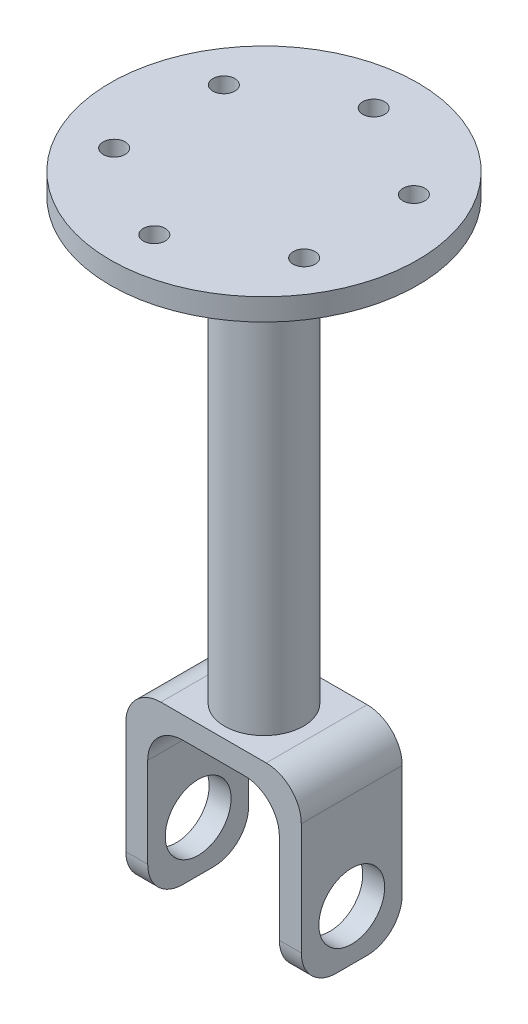
ISO-10303-21;
HEADER;
FILE_DESCRIPTION(('STEP AP214'),'2;1');
FILE_NAME('part.step','',(''),(''),'','','');
FILE_SCHEMA(('AUTOMOTIVE_DESIGN { 1 0 10303 214 1 1 1 1 }'));
ENDSEC;
DATA;
#1=APPLICATION_CONTEXT('core data for automotive mechanical design processes');
#2=APPLICATION_PROTOCOL_DEFINITION('international standard','automotive_design',2000,#1);
#3=PRODUCT_CONTEXT('',#1,'mechanical');
#4=PRODUCT('Part','Part','',(#3));
#5=PRODUCT_RELATED_PRODUCT_CATEGORY('part','',(#4));
#6=PRODUCT_DEFINITION_FORMATION('','',#4);
#7=PRODUCT_DEFINITION_CONTEXT('part definition',#1,'design');
#8=PRODUCT_DEFINITION('design','',#6,#7);
#9=PRODUCT_DEFINITION_SHAPE('','',#8);
#10=(LENGTH_UNIT() NAMED_UNIT(*) SI_UNIT(.MILLI.,.METRE.));
#11=(NAMED_UNIT(*) PLANE_ANGLE_UNIT() SI_UNIT($,.RADIAN.));
#12=(NAMED_UNIT(*) SI_UNIT($,.STERADIAN.) SOLID_ANGLE_UNIT());
#13=UNCERTAINTY_MEASURE_WITH_UNIT(LENGTH_MEASURE(1.E-05),#10,'distance_accuracy_value','');
#14=(GEOMETRIC_REPRESENTATION_CONTEXT(3) GLOBAL_UNCERTAINTY_ASSIGNED_CONTEXT((#13)) GLOBAL_UNIT_ASSIGNED_CONTEXT((#10,
#11,#12)) REPRESENTATION_CONTEXT('',''));
#15=CARTESIAN_POINT('',(0.,0.,0.));
#16=DIRECTION('',(0.,0.,1.));
#17=DIRECTION('',(1.,0.,0.));
#18=AXIS2_PLACEMENT_3D('',#15,#16,#17);
#19=CARTESIAN_POINT('',(20.,813.5,-11.5));
#20=DIRECTION('',(-1.,0.,0.));
#21=DIRECTION('',(0.,0.,1.));
#22=AXIS2_PLACEMENT_3D('',#19,#20,#21);
#23=PLANE('',#22);
#24=CARTESIAN_POINT('',(20.,825.,0.));
#25=DIRECTION('',(-1.,0.,0.));
#26=DIRECTION('',(0.,0.,1.));
#27=AXIS2_PLACEMENT_3D('',#24,#25,#26);
#28=CIRCLE('',#27,7.49999999999996);
#29=CARTESIAN_POINT('',(20.,825.,7.49999999999995));
#30=VERTEX_POINT('',#29);
#31=EDGE_CURVE('E342',#30,#30,#28,.T.);
#32=ORIENTED_EDGE('',*,*,#31,.T.);
#33=EDGE_LOOP('',(#32));
#34=FACE_BOUND('',#33,.T.);
#35=DIRECTION('',(0.,-1.,0.));
#36=VECTOR('',#35,1.);
#37=CARTESIAN_POINT('',(20.,813.5,-11.5));
#38=LINE('',#37,#36);
#39=CARTESIAN_POINT('',(20.,847.,-11.5));
#40=VERTEX_POINT('',#39);
#41=CARTESIAN_POINT('',(20.,821.5,-11.5));
#42=VERTEX_POINT('',#41);
#43=EDGE_CURVE('E172',#40,#42,#38,.T.);
#44=ORIENTED_EDGE('',*,*,#43,.F.);
#45=DIRECTION('',(0.,0.,1.));
#46=VECTOR('',#45,1.);
#47=CARTESIAN_POINT('',(20.,847.,-11.5));
#48=LINE('',#47,#46);
#49=CARTESIAN_POINT('',(20.,847.,11.5));
#50=VERTEX_POINT('',#49);
#51=EDGE_CURVE('E157',#40,#50,#48,.T.);
#52=ORIENTED_EDGE('',*,*,#51,.T.);
#53=DIRECTION('',(0.,-1.,0.));
#54=VECTOR('',#53,1.);
#55=CARTESIAN_POINT('',(20.,813.5,11.5));
#56=LINE('',#55,#54);
#57=CARTESIAN_POINT('',(20.,821.5,11.5));
#58=VERTEX_POINT('',#57);
#59=EDGE_CURVE('E169',#50,#58,#56,.T.);
#60=ORIENTED_EDGE('',*,*,#59,.T.);
#61=CARTESIAN_POINT('',(20.,821.5,3.5));
#62=DIRECTION('',(-1.,0.,0.));
#63=DIRECTION('',(0.,0.,1.));
#64=AXIS2_PLACEMENT_3D('',#61,#62,#63);
#65=CIRCLE('',#64,8.);
#66=CARTESIAN_POINT('',(20.,813.5,3.5));
#67=VERTEX_POINT('',#66);
#68=EDGE_CURVE('E174',#58,#67,#65,.F.);
#69=ORIENTED_EDGE('',*,*,#68,.T.);
#70=DIRECTION('',(0.,0.,1.));
#71=VECTOR('',#70,1.);
#72=CARTESIAN_POINT('',(20.,813.5,-11.5));
#73=LINE('',#72,#71);
#74=CARTESIAN_POINT('',(20.,813.5,-3.5));
#75=VERTEX_POINT('',#74);
#76=EDGE_CURVE('E210',#75,#67,#73,.T.);
#77=ORIENTED_EDGE('',*,*,#76,.F.);
#78=CARTESIAN_POINT('',(20.,821.5,-3.5));
#79=DIRECTION('',(-1.,0.,0.));
#80=DIRECTION('',(0.,0.,1.));
#81=AXIS2_PLACEMENT_3D('',#78,#79,#80);
#82=CIRCLE('',#81,8.);
#83=EDGE_CURVE('E214',#75,#42,#82,.F.);
#84=ORIENTED_EDGE('',*,*,#83,.T.);
#85=EDGE_LOOP('',(#44,#52,#60,#69,#77,#84));
#86=FACE_BOUND('',#85,.T.);
#87=ADVANCED_FACE('F39',(#34,#86),#23,.F.);
#88=CARTESIAN_POINT('',(20.,813.5,-11.5));
#89=DIRECTION('',(0.,1.,0.));
#90=DIRECTION('',(0.,0.,1.));
#91=AXIS2_PLACEMENT_3D('',#88,#89,#90);
#92=PLANE('',#91);
#93=ORIENTED_EDGE('',*,*,#76,.T.);
#94=DIRECTION('',(-1.,0.,0.));
#95=VECTOR('',#94,1.);
#96=CARTESIAN_POINT('',(15.,813.5,3.5));
#97=LINE('',#96,#95);
#98=CARTESIAN_POINT('',(15.,813.5,3.5));
#99=VERTEX_POINT('',#98);
#100=EDGE_CURVE('E254',#67,#99,#97,.T.);
#101=ORIENTED_EDGE('',*,*,#100,.T.);
#102=DIRECTION('',(0.,0.,1.));
#103=VECTOR('',#102,1.);
#104=CARTESIAN_POINT('',(15.,813.5,-11.5));
#105=LINE('',#104,#103);
#106=CARTESIAN_POINT('',(15.,813.5,-3.5));
#107=VERTEX_POINT('',#106);
#108=EDGE_CURVE('E207',#107,#99,#105,.T.);
#109=ORIENTED_EDGE('',*,*,#108,.F.);
#110=DIRECTION('',(-1.,0.,0.));
#111=VECTOR('',#110,1.);
#112=CARTESIAN_POINT('',(20.,813.5,-3.5));
#113=LINE('',#112,#111);
#114=EDGE_CURVE('E252',#107,#75,#113,.F.);
#115=ORIENTED_EDGE('',*,*,#114,.T.);
#116=EDGE_LOOP('',(#93,#101,#109,#115));
#117=FACE_BOUND('',#116,.T.);
#118=ADVANCED_FACE('F390',(#117),#92,.F.);
#119=CARTESIAN_POINT('',(15.,813.5,-11.5));
#120=DIRECTION('',(1.,0.,0.));
#121=DIRECTION('',(0.,0.,-1.));
#122=AXIS2_PLACEMENT_3D('',#119,#120,#121);
#123=PLANE('',#122);
#124=CARTESIAN_POINT('',(15.,825.,0.));
#125=DIRECTION('',(1.,0.,0.));
#126=DIRECTION('',(0.,0.,-1.));
#127=AXIS2_PLACEMENT_3D('',#124,#125,#126);
#128=CIRCLE('',#127,7.49999999999996);
#129=CARTESIAN_POINT('',(15.,825.,-7.49999999999996));
#130=VERTEX_POINT('',#129);
#131=EDGE_CURVE('E347',#130,#130,#128,.T.);
#132=ORIENTED_EDGE('',*,*,#131,.T.);
#133=EDGE_LOOP('',(#132));
#134=FACE_BOUND('',#133,.T.);
#135=DIRECTION('',(0.,1.,0.));
#136=VECTOR('',#135,1.);
#137=CARTESIAN_POINT('',(15.,813.5,11.5));
#138=LINE('',#137,#136);
#139=CARTESIAN_POINT('',(15.,821.5,11.5));
#140=VERTEX_POINT('',#139);
#141=CARTESIAN_POINT('',(15.,842.,11.5));
#142=VERTEX_POINT('',#141);
#143=EDGE_CURVE('E179',#140,#142,#138,.T.);
#144=ORIENTED_EDGE('',*,*,#143,.T.);
#145=DIRECTION('',(0.,0.,1.));
#146=VECTOR('',#145,1.);
#147=CARTESIAN_POINT('',(15.,842.,-11.5));
#148=LINE('',#147,#146);
#149=CARTESIAN_POINT('',(15.,842.,-11.5));
#150=VERTEX_POINT('',#149);
#151=EDGE_CURVE('E243',#142,#150,#148,.F.);
#152=ORIENTED_EDGE('',*,*,#151,.T.);
#153=DIRECTION('',(0.,1.,0.));
#154=VECTOR('',#153,1.);
#155=CARTESIAN_POINT('',(15.,813.5,-11.5));
#156=LINE('',#155,#154);
#157=CARTESIAN_POINT('',(15.,821.5,-11.5));
#158=VERTEX_POINT('',#157);
#159=EDGE_CURVE('E295',#158,#150,#156,.T.);
#160=ORIENTED_EDGE('',*,*,#159,.F.);
#161=CARTESIAN_POINT('',(15.,821.5,-3.5));
#162=DIRECTION('',(1.,0.,0.));
#163=DIRECTION('',(0.,0.,-1.));
#164=AXIS2_PLACEMENT_3D('',#161,#162,#163);
#165=CIRCLE('',#164,8.);
#166=EDGE_CURVE('E239',#158,#107,#165,.F.);
#167=ORIENTED_EDGE('',*,*,#166,.T.);
#168=ORIENTED_EDGE('',*,*,#108,.T.);
#169=CARTESIAN_POINT('',(15.,821.5,3.5));
#170=DIRECTION('',(1.,0.,0.));
#171=DIRECTION('',(0.,0.,-1.));
#172=AXIS2_PLACEMENT_3D('',#169,#170,#171);
#173=CIRCLE('',#172,8.);
#174=EDGE_CURVE('E241',#99,#140,#173,.F.);
#175=ORIENTED_EDGE('',*,*,#174,.T.);
#176=EDGE_LOOP('',(#144,#152,#160,#167,#168,#175));
#177=FACE_BOUND('',#176,.T.);
#178=ADVANCED_FACE('F397',(#134,#177),#123,.F.);
#179=CARTESIAN_POINT('',(15.,850.,-11.5));
#180=DIRECTION('',(0.,1.,0.));
#181=DIRECTION('',(0.,0.,1.));
#182=AXIS2_PLACEMENT_3D('',#179,#180,#181);
#183=PLANE('',#182);
#184=DIRECTION('',(-1.,0.,0.));
#185=VECTOR('',#184,1.);
#186=CARTESIAN_POINT('',(15.,850.,-11.5));
#187=LINE('',#186,#185);
#188=CARTESIAN_POINT('',(7.00000000000002,850.,-11.5));
#189=VERTEX_POINT('',#188);
#190=CARTESIAN_POINT('',(-6.99999999999997,850.,-11.5));
#191=VERTEX_POINT('',#190);
#192=EDGE_CURVE('E287',#189,#191,#187,.T.);
#193=ORIENTED_EDGE('',*,*,#192,.F.);
#194=DIRECTION('',(0.,0.,1.));
#195=VECTOR('',#194,1.);
#196=CARTESIAN_POINT('',(7.00000000000003,850.,11.5));
#197=LINE('',#196,#195);
#198=CARTESIAN_POINT('',(7.00000000000003,850.,11.5));
#199=VERTEX_POINT('',#198);
#200=EDGE_CURVE('E236',#189,#199,#197,.T.);
#201=ORIENTED_EDGE('',*,*,#200,.T.);
#202=DIRECTION('',(-1.,0.,0.));
#203=VECTOR('',#202,1.);
#204=CARTESIAN_POINT('',(15.,850.,11.5));
#205=LINE('',#204,#203);
#206=CARTESIAN_POINT('',(-6.99999999999997,850.,11.5));
#207=VERTEX_POINT('',#206);
#208=EDGE_CURVE('E183',#199,#207,#205,.T.);
#209=ORIENTED_EDGE('',*,*,#208,.T.);
#210=DIRECTION('',(0.,0.,1.));
#211=VECTOR('',#210,1.);
#212=CARTESIAN_POINT('',(-6.99999999999997,850.,-11.5));
#213=LINE('',#212,#211);
#214=EDGE_CURVE('E234',#207,#191,#213,.F.);
#215=ORIENTED_EDGE('',*,*,#214,.T.);
#216=EDGE_LOOP('',(#193,#201,#209,#215));
#217=FACE_BOUND('',#216,.T.);
#218=ADVANCED_FACE('F275',(#217),#183,.F.);
#219=CARTESIAN_POINT('',(-15.,850.,-11.5));
#220=DIRECTION('',(-1.,0.,0.));
#221=DIRECTION('',(0.,0.,1.));
#222=AXIS2_PLACEMENT_3D('',#219,#220,#221);
#223=PLANE('',#222);
#224=CARTESIAN_POINT('',(-15.,825.,0.));
#225=DIRECTION('',(-1.,0.,0.));
#226=DIRECTION('',(0.,0.,1.));
#227=AXIS2_PLACEMENT_3D('',#224,#225,#226);
#228=CIRCLE('',#227,7.49999999999996);
#229=CARTESIAN_POINT('',(-15.,825.,7.49999999999996));
#230=VERTEX_POINT('',#229);
#231=EDGE_CURVE('E350',#230,#230,#228,.T.);
#232=ORIENTED_EDGE('',*,*,#231,.T.);
#233=EDGE_LOOP('',(#232));
#234=FACE_BOUND('',#233,.T.);
#235=DIRECTION('',(0.,-1.,0.));
#236=VECTOR('',#235,1.);
#237=CARTESIAN_POINT('',(-15.,850.,-11.5));
#238=LINE('',#237,#236);
#239=CARTESIAN_POINT('',(-15.,842.,-11.5));
#240=VERTEX_POINT('',#239);
#241=CARTESIAN_POINT('',(-15.,821.5,-11.5));
#242=VERTEX_POINT('',#241);
#243=EDGE_CURVE('E285',#240,#242,#238,.T.);
#244=ORIENTED_EDGE('',*,*,#243,.F.);
#245=DIRECTION('',(0.,0.,1.));
#246=VECTOR('',#245,1.);
#247=CARTESIAN_POINT('',(-15.,842.,11.5));
#248=LINE('',#247,#246);
#249=CARTESIAN_POINT('',(-15.,842.,11.5));
#250=VERTEX_POINT('',#249);
#251=EDGE_CURVE('E249',#240,#250,#248,.T.);
#252=ORIENTED_EDGE('',*,*,#251,.T.);
#253=DIRECTION('',(0.,-1.,0.));
#254=VECTOR('',#253,1.);
#255=CARTESIAN_POINT('',(-15.,850.,11.5));
#256=LINE('',#255,#254);
#257=CARTESIAN_POINT('',(-15.,821.5,11.5));
#258=VERTEX_POINT('',#257);
#259=EDGE_CURVE('E194',#250,#258,#256,.T.);
#260=ORIENTED_EDGE('',*,*,#259,.T.);
#261=CARTESIAN_POINT('',(-15.,821.5,3.5));
#262=DIRECTION('',(-1.,0.,0.));
#263=DIRECTION('',(0.,0.,1.));
#264=AXIS2_PLACEMENT_3D('',#261,#262,#263);
#265=CIRCLE('',#264,8.);
#266=CARTESIAN_POINT('',(-15.,813.5,3.5));
#267=VERTEX_POINT('',#266);
#268=EDGE_CURVE('E247',#258,#267,#265,.F.);
#269=ORIENTED_EDGE('',*,*,#268,.T.);
#270=DIRECTION('',(0.,0.,1.));
#271=VECTOR('',#270,1.);
#272=CARTESIAN_POINT('',(-15.,813.5,-11.5));
#273=LINE('',#272,#271);
#274=CARTESIAN_POINT('',(-15.,813.5,-3.5));
#275=VERTEX_POINT('',#274);
#276=EDGE_CURVE('E204',#275,#267,#273,.T.);
#277=ORIENTED_EDGE('',*,*,#276,.F.);
#278=CARTESIAN_POINT('',(-15.,821.5,-3.5));
#279=DIRECTION('',(-1.,0.,0.));
#280=DIRECTION('',(0.,0.,1.));
#281=AXIS2_PLACEMENT_3D('',#278,#279,#280);
#282=CIRCLE('',#281,8.);
#283=EDGE_CURVE('E245',#275,#242,#282,.F.);
#284=ORIENTED_EDGE('',*,*,#283,.T.);
#285=EDGE_LOOP('',(#244,#252,#260,#269,#277,#284));
#286=FACE_BOUND('',#285,.T.);
#287=ADVANCED_FACE('F289',(#234,#286),#223,.F.);
#288=CARTESIAN_POINT('',(-15.,813.5,-11.5));
#289=DIRECTION('',(0.,1.,0.));
#290=DIRECTION('',(0.,0.,1.));
#291=AXIS2_PLACEMENT_3D('',#288,#289,#290);
#292=PLANE('',#291);
#293=ORIENTED_EDGE('',*,*,#276,.T.);
#294=DIRECTION('',(-1.,0.,0.));
#295=VECTOR('',#294,1.);
#296=CARTESIAN_POINT('',(-20.,813.5,3.5));
#297=LINE('',#296,#295);
#298=CARTESIAN_POINT('',(-20.,813.5,3.5));
#299=VERTEX_POINT('',#298);
#300=EDGE_CURVE('E259',#267,#299,#297,.T.);
#301=ORIENTED_EDGE('',*,*,#300,.T.);
#302=DIRECTION('',(0.,0.,1.));
#303=VECTOR('',#302,1.);
#304=CARTESIAN_POINT('',(-20.,813.5,-11.5));
#305=LINE('',#304,#303);
#306=CARTESIAN_POINT('',(-20.,813.5,-3.5));
#307=VERTEX_POINT('',#306);
#308=EDGE_CURVE('E202',#307,#299,#305,.T.);
#309=ORIENTED_EDGE('',*,*,#308,.F.);
#310=DIRECTION('',(-1.,0.,0.));
#311=VECTOR('',#310,1.);
#312=CARTESIAN_POINT('',(-15.,813.5,-3.5));
#313=LINE('',#312,#311);
#314=EDGE_CURVE('E257',#307,#275,#313,.F.);
#315=ORIENTED_EDGE('',*,*,#314,.T.);
#316=EDGE_LOOP('',(#293,#301,#309,#315));
#317=FACE_BOUND('',#316,.T.);
#318=ADVANCED_FACE('F363',(#317),#292,.F.);
#319=CARTESIAN_POINT('',(-20.,813.5,-11.5));
#320=DIRECTION('',(1.,0.,0.));
#321=DIRECTION('',(0.,0.,-1.));
#322=AXIS2_PLACEMENT_3D('',#319,#320,#321);
#323=PLANE('',#322);
#324=CARTESIAN_POINT('',(-19.9999999999999,825.,0.));
#325=DIRECTION('',(-1.,0.,0.));
#326=DIRECTION('',(0.,0.,1.));
#327=AXIS2_PLACEMENT_3D('',#324,#325,#326);
#328=CIRCLE('',#327,7.49999999999996);
#329=CARTESIAN_POINT('',(-19.9999999999999,825.,7.49999999999996));
#330=VERTEX_POINT('',#329);
#331=EDGE_CURVE('E353',#330,#330,#328,.T.);
#332=ORIENTED_EDGE('',*,*,#331,.F.);
#333=EDGE_LOOP('',(#332));
#334=FACE_BOUND('',#333,.T.);
#335=ORIENTED_EDGE('',*,*,#308,.T.);
#336=CARTESIAN_POINT('',(-20.,821.5,3.5));
#337=DIRECTION('',(1.,0.,0.));
#338=DIRECTION('',(0.,0.,-1.));
#339=AXIS2_PLACEMENT_3D('',#336,#337,#338);
#340=CIRCLE('',#339,8.);
#341=CARTESIAN_POINT('',(-20.,821.5,11.5));
#342=VERTEX_POINT('',#341);
#343=EDGE_CURVE('E54',#299,#342,#340,.F.);
#344=ORIENTED_EDGE('',*,*,#343,.T.);
#345=DIRECTION('',(0.,1.,0.));
#346=VECTOR('',#345,1.);
#347=CARTESIAN_POINT('',(-20.,813.5,11.5));
#348=LINE('',#347,#346);
#349=CARTESIAN_POINT('',(-20.,847.,11.5));
#350=VERTEX_POINT('',#349);
#351=EDGE_CURVE('E197',#342,#350,#348,.T.);
#352=ORIENTED_EDGE('',*,*,#351,.T.);
#353=DIRECTION('',(0.,0.,1.));
#354=VECTOR('',#353,1.);
#355=CARTESIAN_POINT('',(-20.,847.,-11.5));
#356=LINE('',#355,#354);
#357=CARTESIAN_POINT('',(-20.,847.,-11.5));
#358=VERTEX_POINT('',#357);
#359=EDGE_CURVE('E261',#350,#358,#356,.F.);
#360=ORIENTED_EDGE('',*,*,#359,.T.);
#361=DIRECTION('',(0.,1.,0.));
#362=VECTOR('',#361,1.);
#363=CARTESIAN_POINT('',(-20.,813.5,-11.5));
#364=LINE('',#363,#362);
#365=CARTESIAN_POINT('',(-20.,821.5,-11.5));
#366=VERTEX_POINT('',#365);
#367=EDGE_CURVE('E292',#366,#358,#364,.T.);
#368=ORIENTED_EDGE('',*,*,#367,.F.);
#369=CARTESIAN_POINT('',(-20.,821.5,-3.5));
#370=DIRECTION('',(1.,0.,0.));
#371=DIRECTION('',(0.,0.,-1.));
#372=AXIS2_PLACEMENT_3D('',#369,#370,#371);
#373=CIRCLE('',#372,8.);
#374=EDGE_CURVE('E62',#366,#307,#373,.F.);
#375=ORIENTED_EDGE('',*,*,#374,.T.);
#376=EDGE_LOOP('',(#335,#344,#352,#360,#368,#375));
#377=FACE_BOUND('',#376,.T.);
#378=ADVANCED_FACE('F360',(#334,#377),#323,.F.);
#379=CARTESIAN_POINT('',(20.,855.,-11.5));
#380=DIRECTION('',(0.,-1.,0.));
#381=DIRECTION('',(0.,0.,-1.));
#382=AXIS2_PLACEMENT_3D('',#379,#380,#381);
#383=PLANE('',#382);
#384=CARTESIAN_POINT('',(0.,855.,0.));
#385=DIRECTION('',(0.,1.,0.));
#386=DIRECTION('',(0.,0.,1.));
#387=AXIS2_PLACEMENT_3D('',#384,#385,#386);
#388=CIRCLE('',#387,9.);
#389=CARTESIAN_POINT('',(0.,855.,9.));
#390=VERTEX_POINT('',#389);
#391=EDGE_CURVE('E213',#390,#390,#388,.T.);
#392=ORIENTED_EDGE('',*,*,#391,.F.);
#393=EDGE_LOOP('',(#392));
#394=FACE_BOUND('',#393,.T.);
#395=DIRECTION('',(1.,0.,0.));
#396=VECTOR('',#395,1.);
#397=CARTESIAN_POINT('',(20.,855.,11.5));
#398=LINE('',#397,#396);
#399=CARTESIAN_POINT('',(-12.,855.,11.5));
#400=VERTEX_POINT('',#399);
#401=CARTESIAN_POINT('',(12.,855.,11.5));
#402=VERTEX_POINT('',#401);
#403=EDGE_CURVE('E200',#400,#402,#398,.T.);
#404=ORIENTED_EDGE('',*,*,#403,.T.);
#405=DIRECTION('',(0.,0.,1.));
#406=VECTOR('',#405,1.);
#407=CARTESIAN_POINT('',(12.,855.,-11.5));
#408=LINE('',#407,#406);
#409=CARTESIAN_POINT('',(12.,855.,-11.5));
#410=VERTEX_POINT('',#409);
#411=EDGE_CURVE('E158',#402,#410,#408,.F.);
#412=ORIENTED_EDGE('',*,*,#411,.T.);
#413=DIRECTION('',(1.,0.,0.));
#414=VECTOR('',#413,1.);
#415=CARTESIAN_POINT('',(20.,855.,-11.5));
#416=LINE('',#415,#414);
#417=CARTESIAN_POINT('',(-12.,855.,-11.5));
#418=VERTEX_POINT('',#417);
#419=EDGE_CURVE('E189',#418,#410,#416,.T.);
#420=ORIENTED_EDGE('',*,*,#419,.F.);
#421=DIRECTION('',(0.,0.,1.));
#422=VECTOR('',#421,1.);
#423=CARTESIAN_POINT('',(-12.,855.,-11.5));
#424=LINE('',#423,#422);
#425=EDGE_CURVE('E163',#418,#400,#424,.T.);
#426=ORIENTED_EDGE('',*,*,#425,.T.);
#427=EDGE_LOOP('',(#404,#412,#420,#426));
#428=FACE_BOUND('',#427,.T.);
#429=ADVANCED_FACE('F362',(#394,#428),#383,.F.);
#430=CARTESIAN_POINT('',(0.,0.,-11.5));
#431=DIRECTION('',(0.,0.,1.));
#432=DIRECTION('',(1.,0.,0.));
#433=AXIS2_PLACEMENT_3D('',#430,#431,#432);
#434=PLANE('',#433);
#435=ORIENTED_EDGE('',*,*,#419,.T.);
#436=CARTESIAN_POINT('',(12.,847.,-11.5));
#437=DIRECTION('',(0.,0.,1.));
#438=DIRECTION('',(1.,0.,0.));
#439=AXIS2_PLACEMENT_3D('',#436,#437,#438);
#440=CIRCLE('',#439,8.);
#441=EDGE_CURVE('E232',#410,#40,#440,.F.);
#442=ORIENTED_EDGE('',*,*,#441,.T.);
#443=ORIENTED_EDGE('',*,*,#43,.T.);
#444=DIRECTION('',(-1.,0.,0.));
#445=VECTOR('',#444,1.);
#446=CARTESIAN_POINT('',(0.,821.5,-11.5));
#447=LINE('',#446,#445);
#448=EDGE_CURVE('E229',#42,#158,#447,.T.);
#449=ORIENTED_EDGE('',*,*,#448,.T.);
#450=ORIENTED_EDGE('',*,*,#159,.T.);
#451=CARTESIAN_POINT('',(7.00000000000002,842.,-11.5));
#452=DIRECTION('',(0.,0.,1.));
#453=DIRECTION('',(1.,0.,0.));
#454=AXIS2_PLACEMENT_3D('',#451,#452,#453);
#455=CIRCLE('',#454,8.);
#456=EDGE_CURVE('E267',#150,#189,#455,.T.);
#457=ORIENTED_EDGE('',*,*,#456,.T.);
#458=ORIENTED_EDGE('',*,*,#192,.T.);
#459=CARTESIAN_POINT('',(-6.99999999999997,842.,-11.5));
#460=DIRECTION('',(0.,0.,1.));
#461=DIRECTION('',(1.,0.,0.));
#462=AXIS2_PLACEMENT_3D('',#459,#460,#461);
#463=CIRCLE('',#462,8.);
#464=EDGE_CURVE('E11',#191,#240,#463,.T.);
#465=ORIENTED_EDGE('',*,*,#464,.T.);
#466=ORIENTED_EDGE('',*,*,#243,.T.);
#467=DIRECTION('',(-1.,0.,0.));
#468=VECTOR('',#467,1.);
#469=CARTESIAN_POINT('',(0.,821.5,-11.5));
#470=LINE('',#469,#468);
#471=EDGE_CURVE('E226',#242,#366,#470,.T.);
#472=ORIENTED_EDGE('',*,*,#471,.T.);
#473=ORIENTED_EDGE('',*,*,#367,.T.);
#474=CARTESIAN_POINT('',(-12.,847.,-11.5));
#475=DIRECTION('',(0.,0.,1.));
#476=DIRECTION('',(1.,0.,0.));
#477=AXIS2_PLACEMENT_3D('',#474,#475,#476);
#478=CIRCLE('',#477,8.);
#479=EDGE_CURVE('E224',#358,#418,#478,.F.);
#480=ORIENTED_EDGE('',*,*,#479,.T.);
#481=EDGE_LOOP('',(#435,#442,#443,#449,#450,#457,#458,#465,#466,#472,#473,#480));
#482=FACE_BOUND('',#481,.T.);
#483=ADVANCED_FACE('F284',(#482),#434,.F.);
#484=CARTESIAN_POINT('',(0.,0.,11.5));
#485=DIRECTION('',(0.,0.,1.));
#486=DIRECTION('',(1.,0.,0.));
#487=AXIS2_PLACEMENT_3D('',#484,#485,#486);
#488=PLANE('',#487);
#489=ORIENTED_EDGE('',*,*,#59,.F.);
#490=CARTESIAN_POINT('',(12.,847.,11.5));
#491=DIRECTION('',(0.,0.,1.));
#492=DIRECTION('',(1.,0.,0.));
#493=AXIS2_PLACEMENT_3D('',#490,#491,#492);
#494=CIRCLE('',#493,8.);
#495=EDGE_CURVE('E153',#50,#402,#494,.T.);
#496=ORIENTED_EDGE('',*,*,#495,.T.);
#497=ORIENTED_EDGE('',*,*,#403,.F.);
#498=CARTESIAN_POINT('',(-12.,847.,11.5));
#499=DIRECTION('',(0.,0.,1.));
#500=DIRECTION('',(1.,0.,0.));
#501=AXIS2_PLACEMENT_3D('',#498,#499,#500);
#502=CIRCLE('',#501,8.);
#503=EDGE_CURVE('E173',#400,#350,#502,.T.);
#504=ORIENTED_EDGE('',*,*,#503,.T.);
#505=ORIENTED_EDGE('',*,*,#351,.F.);
#506=DIRECTION('',(-1.,0.,0.));
#507=VECTOR('',#506,1.);
#508=CARTESIAN_POINT('',(-15.,821.5,11.5));
#509=LINE('',#508,#507);
#510=EDGE_CURVE('E218',#342,#258,#509,.F.);
#511=ORIENTED_EDGE('',*,*,#510,.T.);
#512=ORIENTED_EDGE('',*,*,#259,.F.);
#513=CARTESIAN_POINT('',(-6.99999999999997,842.,11.5));
#514=DIRECTION('',(0.,0.,1.));
#515=DIRECTION('',(1.,0.,0.));
#516=AXIS2_PLACEMENT_3D('',#513,#514,#515);
#517=CIRCLE('',#516,8.);
#518=EDGE_CURVE('E47',#250,#207,#517,.F.);
#519=ORIENTED_EDGE('',*,*,#518,.T.);
#520=ORIENTED_EDGE('',*,*,#208,.F.);
#521=CARTESIAN_POINT('',(7.00000000000003,842.,11.5));
#522=DIRECTION('',(0.,0.,1.));
#523=DIRECTION('',(1.,0.,0.));
#524=AXIS2_PLACEMENT_3D('',#521,#522,#523);
#525=CIRCLE('',#524,8.);
#526=EDGE_CURVE('E265',#199,#142,#525,.F.);
#527=ORIENTED_EDGE('',*,*,#526,.T.);
#528=ORIENTED_EDGE('',*,*,#143,.F.);
#529=DIRECTION('',(-1.,0.,0.));
#530=VECTOR('',#529,1.);
#531=CARTESIAN_POINT('',(20.,821.5,11.5));
#532=LINE('',#531,#530);
#533=EDGE_CURVE('E164',#140,#58,#532,.F.);
#534=ORIENTED_EDGE('',*,*,#533,.T.);
#535=EDGE_LOOP('',(#489,#496,#497,#504,#505,#511,#512,#519,#520,#527,#528,#534));
#536=FACE_BOUND('',#535,.T.);
#537=ADVANCED_FACE('F176',(#536),#488,.T.);
#538=CARTESIAN_POINT('',(0.,955.,0.));
#539=DIRECTION('',(0.,-1.,0.));
#540=DIRECTION('',(0.,0.,-1.));
#541=AXIS2_PLACEMENT_3D('',#538,#539,#540);
#542=CYLINDRICAL_SURFACE('',#541,9.);
#543=CARTESIAN_POINT('',(0.,955.,0.));
#544=DIRECTION('',(0.,1.,0.));
#545=DIRECTION('',(0.,0.,1.));
#546=AXIS2_PLACEMENT_3D('',#543,#544,#545);
#547=CIRCLE('',#546,9.);
#548=CARTESIAN_POINT('',(0.,955.,9.));
#549=VERTEX_POINT('',#548);
#550=EDGE_CURVE('E180',#549,#549,#547,.T.);
#551=ORIENTED_EDGE('',*,*,#550,.F.);
#552=EDGE_LOOP('',(#551));
#553=FACE_BOUND('',#552,.T.);
#554=ORIENTED_EDGE('',*,*,#391,.T.);
#555=EDGE_LOOP('',(#554));
#556=FACE_BOUND('',#555,.T.);
#557=ADVANCED_FACE('F405',(#553,#556),#542,.T.);
#558=CARTESIAN_POINT('',(12.,847.,-11.5));
#559=DIRECTION('',(0.,0.,1.));
#560=DIRECTION('',(1.,0.,0.));
#561=AXIS2_PLACEMENT_3D('',#558,#559,#560);
#562=CYLINDRICAL_SURFACE('',#561,8.);
#563=ORIENTED_EDGE('',*,*,#441,.F.);
#564=ORIENTED_EDGE('',*,*,#411,.F.);
#565=ORIENTED_EDGE('',*,*,#495,.F.);
#566=ORIENTED_EDGE('',*,*,#51,.F.);
#567=EDGE_LOOP('',(#563,#564,#565,#566));
#568=FACE_BOUND('',#567,.T.);
#569=ADVANCED_FACE('F156',(#568),#562,.T.);
#570=CARTESIAN_POINT('',(7.00000000000002,842.,-11.5));
#571=DIRECTION('',(0.,0.,-1.));
#572=DIRECTION('',(-1.,0.,0.));
#573=AXIS2_PLACEMENT_3D('',#570,#571,#572);
#574=CYLINDRICAL_SURFACE('',#573,8.);
#575=ORIENTED_EDGE('',*,*,#456,.F.);
#576=ORIENTED_EDGE('',*,*,#151,.F.);
#577=ORIENTED_EDGE('',*,*,#526,.F.);
#578=ORIENTED_EDGE('',*,*,#200,.F.);
#579=EDGE_LOOP('',(#575,#576,#577,#578));
#580=FACE_BOUND('',#579,.T.);
#581=ADVANCED_FACE('F404',(#580),#574,.F.);
#582=CARTESIAN_POINT('',(-6.99999999999997,842.,-11.5));
#583=DIRECTION('',(0.,0.,-1.));
#584=DIRECTION('',(-1.,0.,0.));
#585=AXIS2_PLACEMENT_3D('',#582,#583,#584);
#586=CYLINDRICAL_SURFACE('',#585,8.);
#587=ORIENTED_EDGE('',*,*,#464,.F.);
#588=ORIENTED_EDGE('',*,*,#214,.F.);
#589=ORIENTED_EDGE('',*,*,#518,.F.);
#590=ORIENTED_EDGE('',*,*,#251,.F.);
#591=EDGE_LOOP('',(#587,#588,#589,#590));
#592=FACE_BOUND('',#591,.T.);
#593=ADVANCED_FACE('F279',(#592),#586,.F.);
#594=CARTESIAN_POINT('',(20.,821.5,3.5));
#595=DIRECTION('',(1.,0.,0.));
#596=DIRECTION('',(0.,0.,-1.));
#597=AXIS2_PLACEMENT_3D('',#594,#595,#596);
#598=CYLINDRICAL_SURFACE('',#597,8.);
#599=ORIENTED_EDGE('',*,*,#68,.F.);
#600=ORIENTED_EDGE('',*,*,#533,.F.);
#601=ORIENTED_EDGE('',*,*,#174,.F.);
#602=ORIENTED_EDGE('',*,*,#100,.F.);
#603=EDGE_LOOP('',(#599,#600,#601,#602));
#604=FACE_BOUND('',#603,.T.);
#605=ADVANCED_FACE('F386',(#604),#598,.T.);
#606=CARTESIAN_POINT('',(0.,821.5,-3.5));
#607=DIRECTION('',(-1.,0.,0.));
#608=DIRECTION('',(0.,0.,1.));
#609=AXIS2_PLACEMENT_3D('',#606,#607,#608);
#610=CYLINDRICAL_SURFACE('',#609,8.);
#611=ORIENTED_EDGE('',*,*,#83,.F.);
#612=ORIENTED_EDGE('',*,*,#114,.F.);
#613=ORIENTED_EDGE('',*,*,#166,.F.);
#614=ORIENTED_EDGE('',*,*,#448,.F.);
#615=EDGE_LOOP('',(#611,#612,#613,#614));
#616=FACE_BOUND('',#615,.T.);
#617=ADVANCED_FACE('F379',(#616),#610,.T.);
#618=CARTESIAN_POINT('',(-15.,821.5,3.5));
#619=DIRECTION('',(1.,0.,0.));
#620=DIRECTION('',(0.,0.,-1.));
#621=AXIS2_PLACEMENT_3D('',#618,#619,#620);
#622=CYLINDRICAL_SURFACE('',#621,8.);
#623=ORIENTED_EDGE('',*,*,#268,.F.);
#624=ORIENTED_EDGE('',*,*,#510,.F.);
#625=ORIENTED_EDGE('',*,*,#343,.F.);
#626=ORIENTED_EDGE('',*,*,#300,.F.);
#627=EDGE_LOOP('',(#623,#624,#625,#626));
#628=FACE_BOUND('',#627,.T.);
#629=ADVANCED_FACE('F377',(#628),#622,.T.);
#630=CARTESIAN_POINT('',(0.,821.5,-3.5));
#631=DIRECTION('',(-1.,0.,0.));
#632=DIRECTION('',(0.,0.,1.));
#633=AXIS2_PLACEMENT_3D('',#630,#631,#632);
#634=CYLINDRICAL_SURFACE('',#633,8.);
#635=ORIENTED_EDGE('',*,*,#283,.F.);
#636=ORIENTED_EDGE('',*,*,#314,.F.);
#637=ORIENTED_EDGE('',*,*,#374,.F.);
#638=ORIENTED_EDGE('',*,*,#471,.F.);
#639=EDGE_LOOP('',(#635,#636,#637,#638));
#640=FACE_BOUND('',#639,.T.);
#641=ADVANCED_FACE('F369',(#640),#634,.T.);
#642=CARTESIAN_POINT('',(-12.,847.,-11.5));
#643=DIRECTION('',(0.,0.,1.));
#644=DIRECTION('',(1.,0.,0.));
#645=AXIS2_PLACEMENT_3D('',#642,#643,#644);
#646=CYLINDRICAL_SURFACE('',#645,8.);
#647=ORIENTED_EDGE('',*,*,#479,.F.);
#648=ORIENTED_EDGE('',*,*,#359,.F.);
#649=ORIENTED_EDGE('',*,*,#503,.F.);
#650=ORIENTED_EDGE('',*,*,#425,.F.);
#651=EDGE_LOOP('',(#647,#648,#649,#650));
#652=FACE_BOUND('',#651,.T.);
#653=ADVANCED_FACE('F41',(#652),#646,.T.);
#654=CARTESIAN_POINT('',(0.,960.,0.));
#655=DIRECTION('',(0.,1.,0.));
#656=DIRECTION('',(0.,0.,1.));
#657=AXIS2_PLACEMENT_3D('',#654,#655,#656);
#658=PLANE('',#657);
#659=CARTESIAN_POINT('',(-21.6506350946111,960.,12.4999999999998));
#660=DIRECTION('',(0.,1.,0.));
#661=DIRECTION('',(0.,0.,1.));
#662=AXIS2_PLACEMENT_3D('',#659,#660,#661);
#663=CIRCLE('',#662,2.5);
#664=CARTESIAN_POINT('',(-21.6506350946111,960.,14.9999999999998));
#665=VERTEX_POINT('',#664);
#666=EDGE_CURVE('E330',#665,#665,#663,.T.);
#667=ORIENTED_EDGE('',*,*,#666,.F.);
#668=EDGE_LOOP('',(#667));
#669=FACE_BOUND('',#668,.T.);
#670=CARTESIAN_POINT('',(21.6506350946109,960.,12.5000000000001));
#671=DIRECTION('',(0.,1.,0.));
#672=DIRECTION('',(0.,0.,1.));
#673=AXIS2_PLACEMENT_3D('',#670,#671,#672);
#674=CIRCLE('',#673,2.5);
#675=CARTESIAN_POINT('',(21.6506350946109,960.,15.0000000000001));
#676=VERTEX_POINT('',#675);
#677=EDGE_CURVE('E318',#676,#676,#674,.T.);
#678=ORIENTED_EDGE('',*,*,#677,.F.);
#679=EDGE_LOOP('',(#678));
#680=FACE_BOUND('',#679,.T.);
#681=CARTESIAN_POINT('',(0.,960.,-25.));
#682=DIRECTION('',(0.,1.,0.));
#683=DIRECTION('',(0.,0.,1.));
#684=AXIS2_PLACEMENT_3D('',#681,#682,#683);
#685=CIRCLE('',#684,2.5);
#686=CARTESIAN_POINT('',(0.,960.,-22.5));
#687=VERTEX_POINT('',#686);
#688=EDGE_CURVE('E306',#687,#687,#685,.T.);
#689=ORIENTED_EDGE('',*,*,#688,.F.);
#690=EDGE_LOOP('',(#689));
#691=FACE_BOUND('',#690,.T.);
#692=CARTESIAN_POINT('',(0.,960.,0.));
#693=DIRECTION('',(0.,1.,0.));
#694=DIRECTION('',(0.,0.,1.));
#695=AXIS2_PLACEMENT_3D('',#692,#693,#694);
#696=CIRCLE('',#695,35.);
#697=CARTESIAN_POINT('',(0.,960.,35.));
#698=VERTEX_POINT('',#697);
#699=EDGE_CURVE('E186',#698,#698,#696,.T.);
#700=ORIENTED_EDGE('',*,*,#699,.T.);
#701=EDGE_LOOP('',(#700));
#702=FACE_BOUND('',#701,.T.);
#703=CARTESIAN_POINT('',(21.650635094611,960.,-12.5));
#704=DIRECTION('',(0.,1.,0.));
#705=DIRECTION('',(0.,0.,1.));
#706=AXIS2_PLACEMENT_3D('',#703,#704,#705);
#707=CIRCLE('',#706,2.5);
#708=CARTESIAN_POINT('',(21.650635094611,960.,-9.99999999999995));
#709=VERTEX_POINT('',#708);
#710=EDGE_CURVE('E312',#709,#709,#707,.T.);
#711=ORIENTED_EDGE('',*,*,#710,.F.);
#712=EDGE_LOOP('',(#711));
#713=FACE_BOUND('',#712,.T.);
#714=CARTESIAN_POINT('',(-1.74574066942157E-13,960.,25.));
#715=DIRECTION('',(0.,1.,0.));
#716=DIRECTION('',(0.,0.,1.));
#717=AXIS2_PLACEMENT_3D('',#714,#715,#716);
#718=CIRCLE('',#717,2.5);
#719=CARTESIAN_POINT('',(-1.74574066942157E-13,960.,27.5));
#720=VERTEX_POINT('',#719);
#721=EDGE_CURVE('E324',#720,#720,#718,.T.);
#722=ORIENTED_EDGE('',*,*,#721,.F.);
#723=EDGE_LOOP('',(#722));
#724=FACE_BOUND('',#723,.T.);
#725=CARTESIAN_POINT('',(-21.6506350946108,960.,-12.5000000000003));
#726=DIRECTION('',(0.,1.,0.));
#727=DIRECTION('',(0.,0.,1.));
#728=AXIS2_PLACEMENT_3D('',#725,#726,#727);
#729=CIRCLE('',#728,2.5);
#730=CARTESIAN_POINT('',(-21.6506350946108,960.,-10.0000000000003));
#731=VERTEX_POINT('',#730);
#732=EDGE_CURVE('E336',#731,#731,#729,.T.);
#733=ORIENTED_EDGE('',*,*,#732,.F.);
#734=EDGE_LOOP('',(#733));
#735=FACE_BOUND('',#734,.T.);
#736=ADVANCED_FACE('F457',(#669,#680,#691,#702,#713,#724,#735),#658,.T.);
#737=CARTESIAN_POINT('',(0.,955.,0.));
#738=DIRECTION('',(0.,1.,0.));
#739=DIRECTION('',(0.,0.,1.));
#740=AXIS2_PLACEMENT_3D('',#737,#738,#739);
#741=PLANE('',#740);
#742=ORIENTED_EDGE('',*,*,#550,.T.);
#743=EDGE_LOOP('',(#742));
#744=FACE_BOUND('',#743,.T.);
#745=CARTESIAN_POINT('',(0.,955.,0.));
#746=DIRECTION('',(0.,1.,0.));
#747=DIRECTION('',(0.,0.,1.));
#748=AXIS2_PLACEMENT_3D('',#745,#746,#747);
#749=CIRCLE('',#748,35.);
#750=CARTESIAN_POINT('',(0.,955.,35.));
#751=VERTEX_POINT('',#750);
#752=EDGE_CURVE('E303',#751,#751,#749,.T.);
#753=ORIENTED_EDGE('',*,*,#752,.F.);
#754=EDGE_LOOP('',(#753));
#755=FACE_BOUND('',#754,.T.);
#756=CARTESIAN_POINT('',(0.,955.,-25.));
#757=DIRECTION('',(0.,1.,0.));
#758=DIRECTION('',(0.,0.,1.));
#759=AXIS2_PLACEMENT_3D('',#756,#757,#758);
#760=CIRCLE('',#759,2.5);
#761=CARTESIAN_POINT('',(0.,955.,-22.5));
#762=VERTEX_POINT('',#761);
#763=EDGE_CURVE('E309',#762,#762,#760,.T.);
#764=ORIENTED_EDGE('',*,*,#763,.T.);
#765=EDGE_LOOP('',(#764));
#766=FACE_BOUND('',#765,.T.);
#767=CARTESIAN_POINT('',(21.650635094611,955.,-12.5));
#768=DIRECTION('',(0.,1.,0.));
#769=DIRECTION('',(0.,0.,1.));
#770=AXIS2_PLACEMENT_3D('',#767,#768,#769);
#771=CIRCLE('',#770,2.5);
#772=CARTESIAN_POINT('',(21.650635094611,955.,-9.99999999999995));
#773=VERTEX_POINT('',#772);
#774=EDGE_CURVE('E315',#773,#773,#771,.T.);
#775=ORIENTED_EDGE('',*,*,#774,.T.);
#776=EDGE_LOOP('',(#775));
#777=FACE_BOUND('',#776,.T.);
#778=CARTESIAN_POINT('',(21.6506350946109,955.,12.5000000000001));
#779=DIRECTION('',(0.,1.,0.));
#780=DIRECTION('',(0.,0.,1.));
#781=AXIS2_PLACEMENT_3D('',#778,#779,#780);
#782=CIRCLE('',#781,2.5);
#783=CARTESIAN_POINT('',(21.6506350946109,955.,15.0000000000001));
#784=VERTEX_POINT('',#783);
#785=EDGE_CURVE('E321',#784,#784,#782,.T.);
#786=ORIENTED_EDGE('',*,*,#785,.T.);
#787=EDGE_LOOP('',(#786));
#788=FACE_BOUND('',#787,.T.);
#789=CARTESIAN_POINT('',(-1.74574066942157E-13,955.,25.));
#790=DIRECTION('',(0.,1.,0.));
#791=DIRECTION('',(0.,0.,1.));
#792=AXIS2_PLACEMENT_3D('',#789,#790,#791);
#793=CIRCLE('',#792,2.5);
#794=CARTESIAN_POINT('',(-1.74574066942157E-13,955.,27.5));
#795=VERTEX_POINT('',#794);
#796=EDGE_CURVE('E327',#795,#795,#793,.T.);
#797=ORIENTED_EDGE('',*,*,#796,.T.);
#798=EDGE_LOOP('',(#797));
#799=FACE_BOUND('',#798,.T.);
#800=CARTESIAN_POINT('',(-21.6506350946111,955.,12.4999999999998));
#801=DIRECTION('',(0.,1.,0.));
#802=DIRECTION('',(0.,0.,1.));
#803=AXIS2_PLACEMENT_3D('',#800,#801,#802);
#804=CIRCLE('',#803,2.5);
#805=CARTESIAN_POINT('',(-21.6506350946111,955.,14.9999999999998));
#806=VERTEX_POINT('',#805);
#807=EDGE_CURVE('E333',#806,#806,#804,.T.);
#808=ORIENTED_EDGE('',*,*,#807,.T.);
#809=EDGE_LOOP('',(#808));
#810=FACE_BOUND('',#809,.T.);
#811=CARTESIAN_POINT('',(-21.6506350946108,955.,-12.5000000000003));
#812=DIRECTION('',(0.,1.,0.));
#813=DIRECTION('',(0.,0.,1.));
#814=AXIS2_PLACEMENT_3D('',#811,#812,#813);
#815=CIRCLE('',#814,2.5);
#816=CARTESIAN_POINT('',(-21.6506350946108,955.,-10.0000000000003));
#817=VERTEX_POINT('',#816);
#818=EDGE_CURVE('E339',#817,#817,#815,.T.);
#819=ORIENTED_EDGE('',*,*,#818,.T.);
#820=EDGE_LOOP('',(#819));
#821=FACE_BOUND('',#820,.T.);
#822=ADVANCED_FACE('F453',(#744,#755,#766,#777,#788,#799,#810,#821),#741,.F.);
#823=CARTESIAN_POINT('',(0.,960.,0.));
#824=DIRECTION('',(0.,-1.,0.));
#825=DIRECTION('',(0.,0.,-1.));
#826=AXIS2_PLACEMENT_3D('',#823,#824,#825);
#827=CYLINDRICAL_SURFACE('',#826,35.);
#828=ORIENTED_EDGE('',*,*,#699,.F.);
#829=EDGE_LOOP('',(#828));
#830=FACE_BOUND('',#829,.T.);
#831=ORIENTED_EDGE('',*,*,#752,.T.);
#832=EDGE_LOOP('',(#831));
#833=FACE_BOUND('',#832,.T.);
#834=ADVANCED_FACE('F449',(#830,#833),#827,.T.);
#835=CARTESIAN_POINT('',(0.,960.,-25.));
#836=DIRECTION('',(0.,-1.,0.));
#837=DIRECTION('',(0.,0.,-1.));
#838=AXIS2_PLACEMENT_3D('',#835,#836,#837);
#839=CYLINDRICAL_SURFACE('',#838,2.5);
#840=ORIENTED_EDGE('',*,*,#688,.T.);
#841=EDGE_LOOP('',(#840));
#842=FACE_BOUND('',#841,.T.);
#843=ORIENTED_EDGE('',*,*,#763,.F.);
#844=EDGE_LOOP('',(#843));
#845=FACE_BOUND('',#844,.T.);
#846=ADVANCED_FACE('F452',(#842,#845),#839,.F.);
#847=CARTESIAN_POINT('',(21.650635094611,960.,-12.5));
#848=DIRECTION('',(0.,-1.,0.));
#849=DIRECTION('',(0.,0.,-1.));
#850=AXIS2_PLACEMENT_3D('',#847,#848,#849);
#851=CYLINDRICAL_SURFACE('',#850,2.5);
#852=ORIENTED_EDGE('',*,*,#710,.T.);
#853=EDGE_LOOP('',(#852));
#854=FACE_BOUND('',#853,.T.);
#855=ORIENTED_EDGE('',*,*,#774,.F.);
#856=EDGE_LOOP('',(#855));
#857=FACE_BOUND('',#856,.T.);
#858=ADVANCED_FACE('F464',(#854,#857),#851,.F.);
#859=CARTESIAN_POINT('',(21.6506350946109,960.,12.5000000000001));
#860=DIRECTION('',(0.,-1.,0.));
#861=DIRECTION('',(0.,0.,-1.));
#862=AXIS2_PLACEMENT_3D('',#859,#860,#861);
#863=CYLINDRICAL_SURFACE('',#862,2.5);
#864=ORIENTED_EDGE('',*,*,#677,.T.);
#865=EDGE_LOOP('',(#864));
#866=FACE_BOUND('',#865,.T.);
#867=ORIENTED_EDGE('',*,*,#785,.F.);
#868=EDGE_LOOP('',(#867));
#869=FACE_BOUND('',#868,.T.);
#870=ADVANCED_FACE('F468',(#866,#869),#863,.F.);
#871=CARTESIAN_POINT('',(-1.74574066942157E-13,960.,25.));
#872=DIRECTION('',(0.,-1.,0.));
#873=DIRECTION('',(0.,0.,-1.));
#874=AXIS2_PLACEMENT_3D('',#871,#872,#873);
#875=CYLINDRICAL_SURFACE('',#874,2.5);
#876=ORIENTED_EDGE('',*,*,#721,.T.);
#877=EDGE_LOOP('',(#876));
#878=FACE_BOUND('',#877,.T.);
#879=ORIENTED_EDGE('',*,*,#796,.F.);
#880=EDGE_LOOP('',(#879));
#881=FACE_BOUND('',#880,.T.);
#882=ADVANCED_FACE('F472',(#878,#881),#875,.F.);
#883=CARTESIAN_POINT('',(-21.6506350946111,960.,12.4999999999998));
#884=DIRECTION('',(0.,-1.,0.));
#885=DIRECTION('',(0.,0.,-1.));
#886=AXIS2_PLACEMENT_3D('',#883,#884,#885);
#887=CYLINDRICAL_SURFACE('',#886,2.5);
#888=ORIENTED_EDGE('',*,*,#666,.T.);
#889=EDGE_LOOP('',(#888));
#890=FACE_BOUND('',#889,.T.);
#891=ORIENTED_EDGE('',*,*,#807,.F.);
#892=EDGE_LOOP('',(#891));
#893=FACE_BOUND('',#892,.T.);
#894=ADVANCED_FACE('F476',(#890,#893),#887,.F.);
#895=CARTESIAN_POINT('',(-21.6506350946108,960.,-12.5000000000003));
#896=DIRECTION('',(0.,-1.,0.));
#897=DIRECTION('',(0.,0.,-1.));
#898=AXIS2_PLACEMENT_3D('',#895,#896,#897);
#899=CYLINDRICAL_SURFACE('',#898,2.5);
#900=ORIENTED_EDGE('',*,*,#732,.T.);
#901=EDGE_LOOP('',(#900));
#902=FACE_BOUND('',#901,.T.);
#903=ORIENTED_EDGE('',*,*,#818,.F.);
#904=EDGE_LOOP('',(#903));
#905=FACE_BOUND('',#904,.T.);
#906=ADVANCED_FACE('F480',(#902,#905),#899,.F.);
#907=CARTESIAN_POINT('',(35.,825.,0.));
#908=DIRECTION('',(-1.,0.,0.));
#909=DIRECTION('',(0.,0.,1.));
#910=AXIS2_PLACEMENT_3D('',#907,#908,#909);
#911=CYLINDRICAL_SURFACE('',#910,7.49999999999996);
#912=ORIENTED_EDGE('',*,*,#331,.T.);
#913=EDGE_LOOP('',(#912));
#914=FACE_BOUND('',#913,.T.);
#915=ORIENTED_EDGE('',*,*,#231,.F.);
#916=EDGE_LOOP('',(#915));
#917=FACE_BOUND('',#916,.T.);
#918=ADVANCED_FACE('F357',(#914,#917),#911,.F.);
#919=ORIENTED_EDGE('',*,*,#131,.F.);
#920=EDGE_LOOP('',(#919));
#921=FACE_BOUND('',#920,.T.);
#922=ORIENTED_EDGE('',*,*,#31,.F.);
#923=EDGE_LOOP('',(#922));
#924=FACE_BOUND('',#923,.T.);
#925=ADVANCED_FACE('F485',(#921,#924),#911,.F.);
#926=CLOSED_SHELL('',(#87,#118,#178,#218,#287,#318,#378,#429,#483,#537,#557,#569,#581,#593,#605,
#617,#629,#641,#653,#736,#822,#834,#846,#858,#870,#882,#894,#906,#918,#925));
#927=MANIFOLD_SOLID_BREP('B2',#926);
#928=ADVANCED_BREP_SHAPE_REPRESENTATION('',(#18,#927),#14);
#929=SHAPE_DEFINITION_REPRESENTATION(#9,#928);
ENDSEC;
END-ISO-10303-21;
